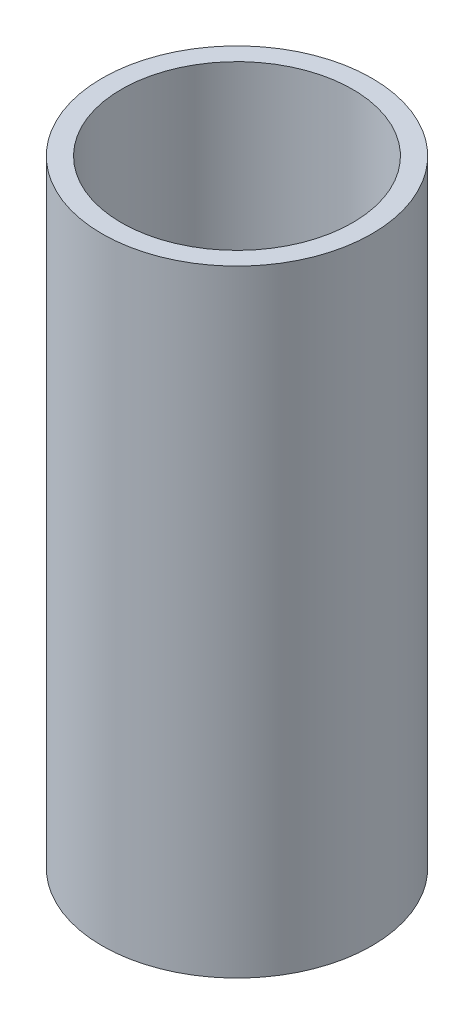
ISO-10303-21;
HEADER;
FILE_DESCRIPTION(('STEP AP214'),'2;1');
FILE_NAME('part.step','',(''),(''),'','','');
FILE_SCHEMA(('AUTOMOTIVE_DESIGN { 1 0 10303 214 1 1 1 1 }'));
ENDSEC;
DATA;
#1=APPLICATION_CONTEXT('core data for automotive mechanical design processes');
#2=APPLICATION_PROTOCOL_DEFINITION('international standard','automotive_design',2000,#1);
#3=PRODUCT_CONTEXT('',#1,'mechanical');
#4=PRODUCT('Part','Part','',(#3));
#5=PRODUCT_RELATED_PRODUCT_CATEGORY('part','',(#4));
#6=PRODUCT_DEFINITION_FORMATION('','',#4);
#7=PRODUCT_DEFINITION_CONTEXT('part definition',#1,'design');
#8=PRODUCT_DEFINITION('design','',#6,#7);
#9=PRODUCT_DEFINITION_SHAPE('','',#8);
#10=(LENGTH_UNIT() NAMED_UNIT(*) SI_UNIT(.MILLI.,.METRE.));
#11=(NAMED_UNIT(*) PLANE_ANGLE_UNIT() SI_UNIT($,.RADIAN.));
#12=(NAMED_UNIT(*) SI_UNIT($,.STERADIAN.) SOLID_ANGLE_UNIT());
#13=UNCERTAINTY_MEASURE_WITH_UNIT(LENGTH_MEASURE(1.E-05),#10,'distance_accuracy_value','');
#14=(GEOMETRIC_REPRESENTATION_CONTEXT(3) GLOBAL_UNCERTAINTY_ASSIGNED_CONTEXT((#13)) GLOBAL_UNIT_ASSIGNED_CONTEXT((#10,
#11,#12)) REPRESENTATION_CONTEXT('',''));
#15=CARTESIAN_POINT('',(0.,0.,0.));
#16=DIRECTION('',(0.,0.,1.));
#17=DIRECTION('',(1.,0.,0.));
#18=AXIS2_PLACEMENT_3D('',#15,#16,#17);
#19=CARTESIAN_POINT('',(0.,203.2,0.));
#20=DIRECTION('',(0.,1.,0.));
#21=DIRECTION('',(0.,0.,1.));
#22=AXIS2_PLACEMENT_3D('',#19,#20,#21);
#23=PLANE('',#22);
#24=CARTESIAN_POINT('',(0.,203.2,0.));
#25=DIRECTION('',(0.,1.,0.));
#26=DIRECTION('',(0.,0.,1.));
#27=AXIS2_PLACEMENT_3D('',#24,#25,#26);
#28=CIRCLE('',#27,44.45);
#29=CARTESIAN_POINT('',(0.,203.2,44.45));
#30=VERTEX_POINT('',#29);
#31=EDGE_CURVE('E10',#30,#30,#28,.T.);
#32=ORIENTED_EDGE('',*,*,#31,.T.);
#33=EDGE_LOOP('',(#32));
#34=FACE_BOUND('',#33,.T.);
#35=CARTESIAN_POINT('',(0.,203.2,0.));
#36=DIRECTION('',(0.,1.,0.));
#37=DIRECTION('',(0.,0.,1.));
#38=AXIS2_PLACEMENT_3D('',#35,#36,#37);
#39=CIRCLE('',#38,38.1);
#40=CARTESIAN_POINT('',(0.,203.2,38.1));
#41=VERTEX_POINT('',#40);
#42=EDGE_CURVE('E42',#41,#41,#39,.T.);
#43=ORIENTED_EDGE('',*,*,#42,.F.);
#44=EDGE_LOOP('',(#43));
#45=FACE_BOUND('',#44,.T.);
#46=ADVANCED_FACE('F31',(#34,#45),#23,.T.);
#47=CARTESIAN_POINT('',(0.,0.,0.));
#48=DIRECTION('',(0.,1.,0.));
#49=DIRECTION('',(0.,0.,1.));
#50=AXIS2_PLACEMENT_3D('',#47,#48,#49);
#51=PLANE('',#50);
#52=CARTESIAN_POINT('',(0.,0.,0.));
#53=DIRECTION('',(0.,1.,0.));
#54=DIRECTION('',(0.,0.,1.));
#55=AXIS2_PLACEMENT_3D('',#52,#53,#54);
#56=CIRCLE('',#55,44.45);
#57=CARTESIAN_POINT('',(0.,0.,44.45));
#58=VERTEX_POINT('',#57);
#59=EDGE_CURVE('E35',#58,#58,#56,.T.);
#60=ORIENTED_EDGE('',*,*,#59,.F.);
#61=EDGE_LOOP('',(#60));
#62=FACE_BOUND('',#61,.T.);
#63=CARTESIAN_POINT('',(0.,0.,0.));
#64=DIRECTION('',(0.,1.,0.));
#65=DIRECTION('',(0.,0.,1.));
#66=AXIS2_PLACEMENT_3D('',#63,#64,#65);
#67=CIRCLE('',#66,38.1);
#68=CARTESIAN_POINT('',(0.,0.,38.1));
#69=VERTEX_POINT('',#68);
#70=EDGE_CURVE('E44',#69,#69,#67,.T.);
#71=ORIENTED_EDGE('',*,*,#70,.T.);
#72=EDGE_LOOP('',(#71));
#73=FACE_BOUND('',#72,.T.);
#74=ADVANCED_FACE('F54',(#62,#73),#51,.F.);
#75=CARTESIAN_POINT('',(0.,203.2,0.));
#76=DIRECTION('',(0.,-1.,0.));
#77=DIRECTION('',(0.,0.,-1.));
#78=AXIS2_PLACEMENT_3D('',#75,#76,#77);
#79=CYLINDRICAL_SURFACE('',#78,44.45);
#80=ORIENTED_EDGE('',*,*,#31,.F.);
#81=EDGE_LOOP('',(#80));
#82=FACE_BOUND('',#81,.T.);
#83=ORIENTED_EDGE('',*,*,#59,.T.);
#84=EDGE_LOOP('',(#83));
#85=FACE_BOUND('',#84,.T.);
#86=ADVANCED_FACE('F33',(#82,#85),#79,.T.);
#87=CARTESIAN_POINT('',(0.,203.2,0.));
#88=DIRECTION('',(0.,-1.,0.));
#89=DIRECTION('',(0.,0.,-1.));
#90=AXIS2_PLACEMENT_3D('',#87,#88,#89);
#91=CYLINDRICAL_SURFACE('',#90,38.1);
#92=ORIENTED_EDGE('',*,*,#42,.T.);
#93=EDGE_LOOP('',(#92));
#94=FACE_BOUND('',#93,.T.);
#95=ORIENTED_EDGE('',*,*,#70,.F.);
#96=EDGE_LOOP('',(#95));
#97=FACE_BOUND('',#96,.T.);
#98=ADVANCED_FACE('F50',(#94,#97),#91,.F.);
#99=CLOSED_SHELL('',(#46,#74,#86,#98));
#100=MANIFOLD_SOLID_BREP('B2',#99);
#101=ADVANCED_BREP_SHAPE_REPRESENTATION('',(#18,#100),#14);
#102=SHAPE_DEFINITION_REPRESENTATION(#9,#101);
ENDSEC;
END-ISO-10303-21;
